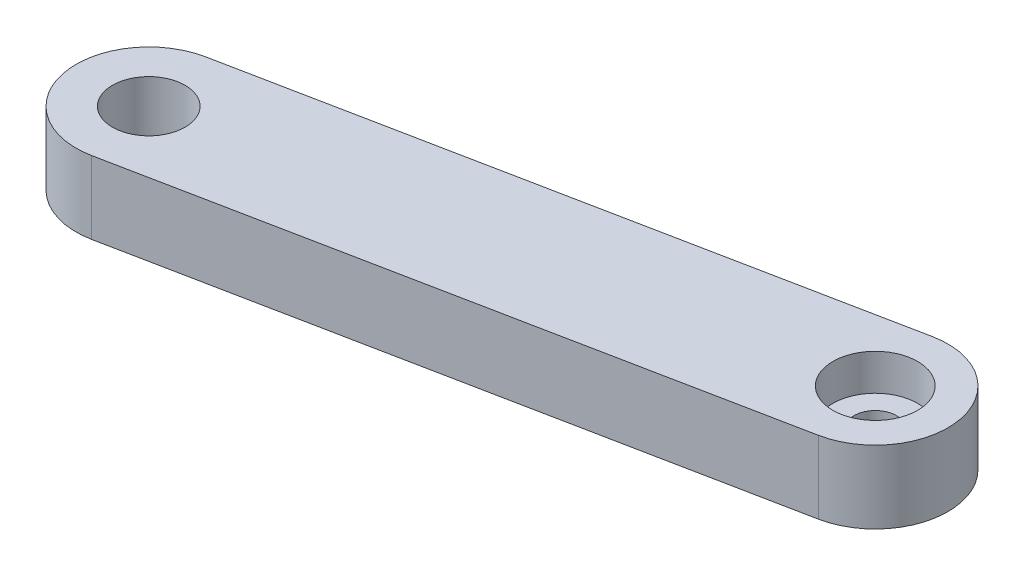
ISO-10303-21;
HEADER;
FILE_DESCRIPTION(('STEP AP214'),'2;1');
FILE_NAME('part.step','',(''),(''),'','','');
FILE_SCHEMA(('AUTOMOTIVE_DESIGN { 1 0 10303 214 1 1 1 1 }'));
ENDSEC;
DATA;
#1=APPLICATION_CONTEXT('core data for automotive mechanical design processes');
#2=APPLICATION_PROTOCOL_DEFINITION('international standard','automotive_design',2000,#1);
#3=PRODUCT_CONTEXT('',#1,'mechanical');
#4=PRODUCT('Part','Part','',(#3));
#5=PRODUCT_RELATED_PRODUCT_CATEGORY('part','',(#4));
#6=PRODUCT_DEFINITION_FORMATION('','',#4);
#7=PRODUCT_DEFINITION_CONTEXT('part definition',#1,'design');
#8=PRODUCT_DEFINITION('design','',#6,#7);
#9=PRODUCT_DEFINITION_SHAPE('','',#8);
#10=(LENGTH_UNIT() NAMED_UNIT(*) SI_UNIT(.MILLI.,.METRE.));
#11=(NAMED_UNIT(*) PLANE_ANGLE_UNIT() SI_UNIT($,.RADIAN.));
#12=(NAMED_UNIT(*) SI_UNIT($,.STERADIAN.) SOLID_ANGLE_UNIT());
#13=UNCERTAINTY_MEASURE_WITH_UNIT(LENGTH_MEASURE(1.E-05),#10,'distance_accuracy_value','');
#14=(GEOMETRIC_REPRESENTATION_CONTEXT(3) GLOBAL_UNCERTAINTY_ASSIGNED_CONTEXT((#13)) GLOBAL_UNIT_ASSIGNED_CONTEXT((#10,
#11,#12)) REPRESENTATION_CONTEXT('',''));
#15=CARTESIAN_POINT('',(0.,0.,0.));
#16=DIRECTION('',(0.,0.,1.));
#17=DIRECTION('',(1.,0.,0.));
#18=AXIS2_PLACEMENT_3D('',#15,#16,#17);
#19=CARTESIAN_POINT('',(0.,6.,0.));
#20=DIRECTION('',(0.,-1.,0.));
#21=DIRECTION('',(0.,0.,-1.));
#22=AXIS2_PLACEMENT_3D('',#19,#20,#21);
#23=CYLINDRICAL_SURFACE('',#22,1.75);
#24=CARTESIAN_POINT('',(0.,0.,0.));
#25=DIRECTION('',(0.,1.,0.));
#26=DIRECTION('',(0.,0.,1.));
#27=AXIS2_PLACEMENT_3D('',#24,#25,#26);
#28=CIRCLE('',#27,1.75);
#29=CARTESIAN_POINT('',(0.,0.,1.75));
#30=VERTEX_POINT('',#29);
#31=EDGE_CURVE('E102',#30,#30,#28,.T.);
#32=ORIENTED_EDGE('',*,*,#31,.F.);
#33=EDGE_LOOP('',(#32));
#34=FACE_BOUND('',#33,.T.);
#35=CARTESIAN_POINT('',(0.,3.,0.));
#36=DIRECTION('',(0.,1.,0.));
#37=DIRECTION('',(0.,0.,1.));
#38=AXIS2_PLACEMENT_3D('',#35,#36,#37);
#39=CIRCLE('',#38,1.75);
#40=CARTESIAN_POINT('',(0.,3.,1.75));
#41=VERTEX_POINT('',#40);
#42=EDGE_CURVE('E36',#41,#41,#39,.T.);
#43=ORIENTED_EDGE('',*,*,#42,.T.);
#44=EDGE_LOOP('',(#43));
#45=FACE_BOUND('',#44,.T.);
#46=ADVANCED_FACE('F32',(#34,#45),#23,.F.);
#47=CARTESIAN_POINT('',(0.,6.,0.));
#48=DIRECTION('',(0.,1.,0.));
#49=DIRECTION('',(0.,0.,1.));
#50=AXIS2_PLACEMENT_3D('',#47,#48,#49);
#51=PLANE('',#50);
#52=CARTESIAN_POINT('',(0.,6.,0.));
#53=DIRECTION('',(0.,1.,0.));
#54=DIRECTION('',(0.,0.,1.));
#55=AXIS2_PLACEMENT_3D('',#52,#53,#54);
#56=CIRCLE('',#55,3.5);
#57=CARTESIAN_POINT('',(0.,6.,3.5));
#58=VERTEX_POINT('',#57);
#59=EDGE_CURVE('E122',#58,#58,#56,.T.);
#60=ORIENTED_EDGE('',*,*,#59,.F.);
#61=EDGE_LOOP('',(#60));
#62=FACE_BOUND('',#61,.T.);
#63=CARTESIAN_POINT('',(0.,6.,0.));
#64=DIRECTION('',(0.,1.,0.));
#65=DIRECTION('',(0.,0.,1.));
#66=AXIS2_PLACEMENT_3D('',#63,#64,#65);
#67=CIRCLE('',#66,6.);
#68=CARTESIAN_POINT('',(1.1766968108291,6.,5.88348405414551));
#69=VERTEX_POINT('',#68);
#70=CARTESIAN_POINT('',(-1.1766968108291,6.,-5.88348405414552));
#71=VERTEX_POINT('',#70);
#72=EDGE_CURVE('E86',#69,#71,#67,.T.);
#73=ORIENTED_EDGE('',*,*,#72,.T.);
#74=DIRECTION('',(-0.98058067569092,0.,0.196116135138184));
#75=VECTOR('',#74,1.);
#76=CARTESIAN_POINT('',(-1.1766968108291,6.,-5.88348405414552));
#77=LINE('',#76,#75);
#78=CARTESIAN_POINT('',(-51.1766968108291,6.,4.11651594585448));
#79=VERTEX_POINT('',#78);
#80=EDGE_CURVE('E80',#71,#79,#77,.T.);
#81=ORIENTED_EDGE('',*,*,#80,.T.);
#82=CARTESIAN_POINT('',(-50.,6.,10.));
#83=DIRECTION('',(0.,1.,0.));
#84=DIRECTION('',(0.,0.,1.));
#85=AXIS2_PLACEMENT_3D('',#82,#83,#84);
#86=CIRCLE('',#85,6.);
#87=CARTESIAN_POINT('',(-48.8233031891709,6.,15.8834840541455));
#88=VERTEX_POINT('',#87);
#89=EDGE_CURVE('E84',#79,#88,#86,.T.);
#90=ORIENTED_EDGE('',*,*,#89,.T.);
#91=DIRECTION('',(0.98058067569092,0.,-0.196116135138184));
#92=VECTOR('',#91,1.);
#93=CARTESIAN_POINT('',(1.1766968108291,6.,5.88348405414551));
#94=LINE('',#93,#92);
#95=EDGE_CURVE('E50',#88,#69,#94,.T.);
#96=ORIENTED_EDGE('',*,*,#95,.T.);
#97=EDGE_LOOP('',(#73,#81,#90,#96));
#98=FACE_BOUND('',#97,.T.);
#99=CARTESIAN_POINT('',(-50.,6.,10.));
#100=DIRECTION('',(0.,1.,0.));
#101=DIRECTION('',(0.,0.,1.));
#102=AXIS2_PLACEMENT_3D('',#99,#100,#101);
#103=CIRCLE('',#102,3.);
#104=CARTESIAN_POINT('',(-50.,6.,13.));
#105=VERTEX_POINT('',#104);
#106=EDGE_CURVE('E116',#105,#105,#103,.T.);
#107=ORIENTED_EDGE('',*,*,#106,.F.);
#108=EDGE_LOOP('',(#107));
#109=FACE_BOUND('',#108,.T.);
#110=ADVANCED_FACE('F81',(#62,#98,#109),#51,.T.);
#111=CARTESIAN_POINT('',(0.,0.,0.));
#112=DIRECTION('',(0.,1.,0.));
#113=DIRECTION('',(0.,0.,1.));
#114=AXIS2_PLACEMENT_3D('',#111,#112,#113);
#115=PLANE('',#114);
#116=ORIENTED_EDGE('',*,*,#31,.T.);
#117=EDGE_LOOP('',(#116));
#118=FACE_BOUND('',#117,.T.);
#119=CARTESIAN_POINT('',(0.,0.,0.));
#120=DIRECTION('',(0.,1.,0.));
#121=DIRECTION('',(0.,0.,1.));
#122=AXIS2_PLACEMENT_3D('',#119,#120,#121);
#123=CIRCLE('',#122,6.);
#124=CARTESIAN_POINT('',(1.1766968108291,0.,5.88348405414551));
#125=VERTEX_POINT('',#124);
#126=CARTESIAN_POINT('',(-1.1766968108291,0.,-5.88348405414552));
#127=VERTEX_POINT('',#126);
#128=EDGE_CURVE('E99',#125,#127,#123,.T.);
#129=ORIENTED_EDGE('',*,*,#128,.F.);
#130=DIRECTION('',(0.98058067569092,0.,-0.196116135138184));
#131=VECTOR('',#130,1.);
#132=CARTESIAN_POINT('',(1.1766968108291,0.,5.88348405414551));
#133=LINE('',#132,#131);
#134=CARTESIAN_POINT('',(-48.8233031891709,0.,15.8834840541455));
#135=VERTEX_POINT('',#134);
#136=EDGE_CURVE('E73',#135,#125,#133,.T.);
#137=ORIENTED_EDGE('',*,*,#136,.F.);
#138=CARTESIAN_POINT('',(-50.,0.,10.));
#139=DIRECTION('',(0.,1.,0.));
#140=DIRECTION('',(0.,0.,1.));
#141=AXIS2_PLACEMENT_3D('',#138,#139,#140);
#142=CIRCLE('',#141,6.);
#143=CARTESIAN_POINT('',(-51.1766968108291,0.,4.11651594585448));
#144=VERTEX_POINT('',#143);
#145=EDGE_CURVE('E67',#144,#135,#142,.T.);
#146=ORIENTED_EDGE('',*,*,#145,.F.);
#147=DIRECTION('',(-0.98058067569092,0.,0.196116135138184));
#148=VECTOR('',#147,1.);
#149=CARTESIAN_POINT('',(-1.1766968108291,0.,-5.88348405414552));
#150=LINE('',#149,#148);
#151=EDGE_CURVE('E90',#127,#144,#150,.T.);
#152=ORIENTED_EDGE('',*,*,#151,.F.);
#153=EDGE_LOOP('',(#129,#137,#146,#152));
#154=FACE_BOUND('',#153,.T.);
#155=CARTESIAN_POINT('',(-50.,0.,10.));
#156=DIRECTION('',(0.,1.,0.));
#157=DIRECTION('',(0.,0.,1.));
#158=AXIS2_PLACEMENT_3D('',#155,#156,#157);
#159=CIRCLE('',#158,3.);
#160=CARTESIAN_POINT('',(-50.,0.,13.));
#161=VERTEX_POINT('',#160);
#162=EDGE_CURVE('E117',#161,#161,#159,.T.);
#163=ORIENTED_EDGE('',*,*,#162,.T.);
#164=EDGE_LOOP('',(#163));
#165=FACE_BOUND('',#164,.T.);
#166=ADVANCED_FACE('F110',(#118,#154,#165),#115,.F.);
#167=CARTESIAN_POINT('',(0.,6.,0.));
#168=DIRECTION('',(0.,-1.,0.));
#169=DIRECTION('',(0.,0.,-1.));
#170=AXIS2_PLACEMENT_3D('',#167,#168,#169);
#171=CYLINDRICAL_SURFACE('',#170,6.);
#172=ORIENTED_EDGE('',*,*,#128,.T.);
#173=DIRECTION('',(0.,-1.,0.));
#174=VECTOR('',#173,1.);
#175=CARTESIAN_POINT('',(-1.1766968108291,6.,-5.88348405414552));
#176=LINE('',#175,#174);
#177=EDGE_CURVE('E11',#71,#127,#176,.T.);
#178=ORIENTED_EDGE('',*,*,#177,.F.);
#179=ORIENTED_EDGE('',*,*,#72,.F.);
#180=DIRECTION('',(0.,-1.,0.));
#181=VECTOR('',#180,1.);
#182=CARTESIAN_POINT('',(1.1766968108291,6.,5.88348405414551));
#183=LINE('',#182,#181);
#184=EDGE_CURVE('E95',#69,#125,#183,.T.);
#185=ORIENTED_EDGE('',*,*,#184,.T.);
#186=EDGE_LOOP('',(#172,#178,#179,#185));
#187=FACE_BOUND('',#186,.T.);
#188=ADVANCED_FACE('F34',(#187),#171,.T.);
#189=CARTESIAN_POINT('',(-1.1766968108291,6.,-5.88348405414552));
#190=DIRECTION('',(0.196116135138184,0.,0.98058067569092));
#191=DIRECTION('',(0.98058067569092,0.,-0.196116135138184));
#192=AXIS2_PLACEMENT_3D('',#189,#190,#191);
#193=PLANE('',#192);
#194=ORIENTED_EDGE('',*,*,#151,.T.);
#195=DIRECTION('',(0.,-1.,0.));
#196=VECTOR('',#195,1.);
#197=CARTESIAN_POINT('',(-51.1766968108291,6.,4.11651594585448));
#198=LINE('',#197,#196);
#199=EDGE_CURVE('E42',#79,#144,#198,.T.);
#200=ORIENTED_EDGE('',*,*,#199,.F.);
#201=ORIENTED_EDGE('',*,*,#80,.F.);
#202=ORIENTED_EDGE('',*,*,#177,.T.);
#203=EDGE_LOOP('',(#194,#200,#201,#202));
#204=FACE_BOUND('',#203,.T.);
#205=ADVANCED_FACE('F89',(#204),#193,.F.);
#206=CARTESIAN_POINT('',(-50.,6.,10.));
#207=DIRECTION('',(0.,-1.,0.));
#208=DIRECTION('',(0.,0.,-1.));
#209=AXIS2_PLACEMENT_3D('',#206,#207,#208);
#210=CYLINDRICAL_SURFACE('',#209,6.);
#211=ORIENTED_EDGE('',*,*,#145,.T.);
#212=DIRECTION('',(0.,-1.,0.));
#213=VECTOR('',#212,1.);
#214=CARTESIAN_POINT('',(-48.8233031891709,6.,15.8834840541455));
#215=LINE('',#214,#213);
#216=EDGE_CURVE('E91',#88,#135,#215,.T.);
#217=ORIENTED_EDGE('',*,*,#216,.F.);
#218=ORIENTED_EDGE('',*,*,#89,.F.);
#219=ORIENTED_EDGE('',*,*,#199,.T.);
#220=EDGE_LOOP('',(#211,#217,#218,#219));
#221=FACE_BOUND('',#220,.T.);
#222=ADVANCED_FACE('F93',(#221),#210,.T.);
#223=CARTESIAN_POINT('',(1.1766968108291,6.,5.88348405414551));
#224=DIRECTION('',(-0.196116135138184,0.,-0.98058067569092));
#225=DIRECTION('',(-0.98058067569092,0.,0.196116135138184));
#226=AXIS2_PLACEMENT_3D('',#223,#224,#225);
#227=PLANE('',#226);
#228=ORIENTED_EDGE('',*,*,#136,.T.);
#229=ORIENTED_EDGE('',*,*,#184,.F.);
#230=ORIENTED_EDGE('',*,*,#95,.F.);
#231=ORIENTED_EDGE('',*,*,#216,.T.);
#232=EDGE_LOOP('',(#228,#229,#230,#231));
#233=FACE_BOUND('',#232,.T.);
#234=ADVANCED_FACE('F107',(#233),#227,.F.);
#235=CARTESIAN_POINT('',(-50.,6.,10.));
#236=DIRECTION('',(0.,-1.,0.));
#237=DIRECTION('',(0.,0.,-1.));
#238=AXIS2_PLACEMENT_3D('',#235,#236,#237);
#239=CYLINDRICAL_SURFACE('',#238,3.);
#240=ORIENTED_EDGE('',*,*,#106,.T.);
#241=EDGE_LOOP('',(#240));
#242=FACE_BOUND('',#241,.T.);
#243=ORIENTED_EDGE('',*,*,#162,.F.);
#244=EDGE_LOOP('',(#243));
#245=FACE_BOUND('',#244,.T.);
#246=ADVANCED_FACE('F140',(#242,#245),#239,.F.);
#247=CARTESIAN_POINT('',(0.,3.,0.));
#248=DIRECTION('',(0.,1.,0.));
#249=DIRECTION('',(0.,0.,1.));
#250=AXIS2_PLACEMENT_3D('',#247,#248,#249);
#251=CYLINDRICAL_SURFACE('',#250,3.5);
#252=CARTESIAN_POINT('',(0.,3.,0.));
#253=DIRECTION('',(0.,1.,0.));
#254=DIRECTION('',(0.,0.,1.));
#255=AXIS2_PLACEMENT_3D('',#252,#253,#254);
#256=CIRCLE('',#255,3.5);
#257=CARTESIAN_POINT('',(0.,3.,3.5));
#258=VERTEX_POINT('',#257);
#259=EDGE_CURVE('E125',#258,#258,#256,.T.);
#260=ORIENTED_EDGE('',*,*,#259,.F.);
#261=EDGE_LOOP('',(#260));
#262=FACE_BOUND('',#261,.T.);
#263=ORIENTED_EDGE('',*,*,#59,.T.);
#264=EDGE_LOOP('',(#263));
#265=FACE_BOUND('',#264,.T.);
#266=ADVANCED_FACE('F135',(#262,#265),#251,.F.);
#267=CARTESIAN_POINT('',(0.,3.,0.));
#268=DIRECTION('',(0.,1.,0.));
#269=DIRECTION('',(0.,0.,1.));
#270=AXIS2_PLACEMENT_3D('',#267,#268,#269);
#271=PLANE('',#270);
#272=ORIENTED_EDGE('',*,*,#42,.F.);
#273=EDGE_LOOP('',(#272));
#274=FACE_BOUND('',#273,.T.);
#275=ORIENTED_EDGE('',*,*,#259,.T.);
#276=EDGE_LOOP('',(#275));
#277=FACE_BOUND('',#276,.T.);
#278=ADVANCED_FACE('F133',(#274,#277),#271,.T.);
#279=CLOSED_SHELL('',(#46,#110,#166,#188,#205,#222,#234,#246,#266,#278));
#280=MANIFOLD_SOLID_BREP('B2',#279);
#281=ADVANCED_BREP_SHAPE_REPRESENTATION('',(#18,#280),#14);
#282=SHAPE_DEFINITION_REPRESENTATION(#9,#281);
ENDSEC;
END-ISO-10303-21;
